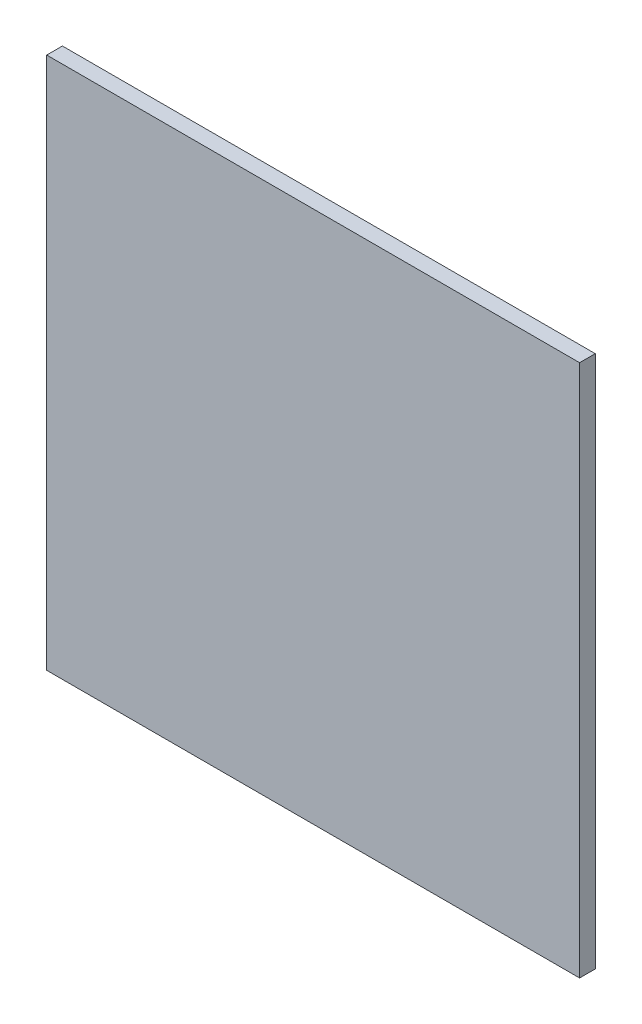
ISO-10303-21;
HEADER;
FILE_DESCRIPTION(('STEP AP214'),'2;1');
FILE_NAME('part.step','',(''),(''),'','','');
FILE_SCHEMA(('AUTOMOTIVE_DESIGN { 1 0 10303 214 1 1 1 1 }'));
ENDSEC;
DATA;
#1=APPLICATION_CONTEXT('core data for automotive mechanical design processes');
#2=APPLICATION_PROTOCOL_DEFINITION('international standard','automotive_design',2000,#1);
#3=PRODUCT_CONTEXT('',#1,'mechanical');
#4=PRODUCT('Part','Part','',(#3));
#5=PRODUCT_RELATED_PRODUCT_CATEGORY('part','',(#4));
#6=PRODUCT_DEFINITION_FORMATION('','',#4);
#7=PRODUCT_DEFINITION_CONTEXT('part definition',#1,'design');
#8=PRODUCT_DEFINITION('design','',#6,#7);
#9=PRODUCT_DEFINITION_SHAPE('','',#8);
#10=(LENGTH_UNIT() NAMED_UNIT(*) SI_UNIT(.MILLI.,.METRE.));
#11=(NAMED_UNIT(*) PLANE_ANGLE_UNIT() SI_UNIT($,.RADIAN.));
#12=(NAMED_UNIT(*) SI_UNIT($,.STERADIAN.) SOLID_ANGLE_UNIT());
#13=UNCERTAINTY_MEASURE_WITH_UNIT(LENGTH_MEASURE(1.E-05),#10,'distance_accuracy_value','');
#14=(GEOMETRIC_REPRESENTATION_CONTEXT(3) GLOBAL_UNCERTAINTY_ASSIGNED_CONTEXT((#13)) GLOBAL_UNIT_ASSIGNED_CONTEXT((#10,
#11,#12)) REPRESENTATION_CONTEXT('',''));
#15=CARTESIAN_POINT('',(0.,0.,0.));
#16=DIRECTION('',(0.,0.,1.));
#17=DIRECTION('',(1.,0.,0.));
#18=AXIS2_PLACEMENT_3D('',#15,#16,#17);
#19=CARTESIAN_POINT('',(51.,51.,3.));
#20=DIRECTION('',(-1.,0.,0.));
#21=DIRECTION('',(0.,-1.,0.));
#22=AXIS2_PLACEMENT_3D('',#19,#20,#21);
#23=PLANE('',#22);
#24=DIRECTION('',(0.,1.,0.));
#25=VECTOR('',#24,1.);
#26=CARTESIAN_POINT('',(51.,51.,0.));
#27=LINE('',#26,#25);
#28=CARTESIAN_POINT('',(51.,-51.,0.));
#29=VERTEX_POINT('',#28);
#30=CARTESIAN_POINT('',(51.,51.,0.));
#31=VERTEX_POINT('',#30);
#32=EDGE_CURVE('E99',#29,#31,#27,.T.);
#33=ORIENTED_EDGE('',*,*,#32,.T.);
#34=DIRECTION('',(0.,0.,-1.));
#35=VECTOR('',#34,1.);
#36=CARTESIAN_POINT('',(51.,51.,3.));
#37=LINE('',#36,#35);
#38=CARTESIAN_POINT('',(51.,51.,3.));
#39=VERTEX_POINT('',#38);
#40=EDGE_CURVE('E11',#39,#31,#37,.T.);
#41=ORIENTED_EDGE('',*,*,#40,.F.);
#42=DIRECTION('',(0.,1.,0.));
#43=VECTOR('',#42,1.);
#44=CARTESIAN_POINT('',(51.,51.,3.));
#45=LINE('',#44,#43);
#46=CARTESIAN_POINT('',(51.,-51.,3.));
#47=VERTEX_POINT('',#46);
#48=EDGE_CURVE('E87',#47,#39,#45,.T.);
#49=ORIENTED_EDGE('',*,*,#48,.F.);
#50=DIRECTION('',(0.,0.,-1.));
#51=VECTOR('',#50,1.);
#52=CARTESIAN_POINT('',(51.,-51.,3.));
#53=LINE('',#52,#51);
#54=EDGE_CURVE('E95',#47,#29,#53,.T.);
#55=ORIENTED_EDGE('',*,*,#54,.T.);
#56=EDGE_LOOP('',(#33,#41,#49,#55));
#57=FACE_BOUND('',#56,.T.);
#58=ADVANCED_FACE('F36',(#57),#23,.F.);
#59=CARTESIAN_POINT('',(-51.,51.,3.));
#60=DIRECTION('',(0.,-1.,0.));
#61=DIRECTION('',(0.,0.,-1.));
#62=AXIS2_PLACEMENT_3D('',#59,#60,#61);
#63=PLANE('',#62);
#64=DIRECTION('',(-1.,0.,0.));
#65=VECTOR('',#64,1.);
#66=CARTESIAN_POINT('',(-51.,51.,0.));
#67=LINE('',#66,#65);
#68=CARTESIAN_POINT('',(-51.,51.,0.));
#69=VERTEX_POINT('',#68);
#70=EDGE_CURVE('E91',#31,#69,#67,.T.);
#71=ORIENTED_EDGE('',*,*,#70,.T.);
#72=DIRECTION('',(0.,0.,-1.));
#73=VECTOR('',#72,1.);
#74=CARTESIAN_POINT('',(-51.,51.,3.));
#75=LINE('',#74,#73);
#76=CARTESIAN_POINT('',(-51.,51.,3.));
#77=VERTEX_POINT('',#76);
#78=EDGE_CURVE('E44',#77,#69,#75,.T.);
#79=ORIENTED_EDGE('',*,*,#78,.F.);
#80=DIRECTION('',(-1.,0.,0.));
#81=VECTOR('',#80,1.);
#82=CARTESIAN_POINT('',(-51.,51.,3.));
#83=LINE('',#82,#81);
#84=EDGE_CURVE('E82',#39,#77,#83,.T.);
#85=ORIENTED_EDGE('',*,*,#84,.F.);
#86=ORIENTED_EDGE('',*,*,#40,.T.);
#87=EDGE_LOOP('',(#71,#79,#85,#86));
#88=FACE_BOUND('',#87,.T.);
#89=ADVANCED_FACE('F90',(#88),#63,.F.);
#90=CARTESIAN_POINT('',(-51.,51.,3.));
#91=DIRECTION('',(1.,0.,0.));
#92=DIRECTION('',(0.,1.,0.));
#93=AXIS2_PLACEMENT_3D('',#90,#91,#92);
#94=PLANE('',#93);
#95=DIRECTION('',(0.,-1.,0.));
#96=VECTOR('',#95,1.);
#97=CARTESIAN_POINT('',(-51.,51.,0.));
#98=LINE('',#97,#96);
#99=CARTESIAN_POINT('',(-51.,-51.,0.));
#100=VERTEX_POINT('',#99);
#101=EDGE_CURVE('E69',#69,#100,#98,.T.);
#102=ORIENTED_EDGE('',*,*,#101,.T.);
#103=DIRECTION('',(0.,0.,-1.));
#104=VECTOR('',#103,1.);
#105=CARTESIAN_POINT('',(-51.,-51.,3.));
#106=LINE('',#105,#104);
#107=CARTESIAN_POINT('',(-51.,-51.,3.));
#108=VERTEX_POINT('',#107);
#109=EDGE_CURVE('E92',#108,#100,#106,.T.);
#110=ORIENTED_EDGE('',*,*,#109,.F.);
#111=DIRECTION('',(0.,-1.,0.));
#112=VECTOR('',#111,1.);
#113=CARTESIAN_POINT('',(-51.,51.,3.));
#114=LINE('',#113,#112);
#115=EDGE_CURVE('E85',#77,#108,#114,.T.);
#116=ORIENTED_EDGE('',*,*,#115,.F.);
#117=ORIENTED_EDGE('',*,*,#78,.T.);
#118=EDGE_LOOP('',(#102,#110,#116,#117));
#119=FACE_BOUND('',#118,.T.);
#120=ADVANCED_FACE('F93',(#119),#94,.F.);
#121=CARTESIAN_POINT('',(-51.,-51.,3.));
#122=DIRECTION('',(0.,1.,0.));
#123=DIRECTION('',(0.,0.,1.));
#124=AXIS2_PLACEMENT_3D('',#121,#122,#123);
#125=PLANE('',#124);
#126=DIRECTION('',(1.,0.,0.));
#127=VECTOR('',#126,1.);
#128=CARTESIAN_POINT('',(-51.,-51.,0.));
#129=LINE('',#128,#127);
#130=EDGE_CURVE('E75',#100,#29,#129,.T.);
#131=ORIENTED_EDGE('',*,*,#130,.T.);
#132=ORIENTED_EDGE('',*,*,#54,.F.);
#133=DIRECTION('',(1.,0.,0.));
#134=VECTOR('',#133,1.);
#135=CARTESIAN_POINT('',(-51.,-51.,3.));
#136=LINE('',#135,#134);
#137=EDGE_CURVE('E52',#108,#47,#136,.T.);
#138=ORIENTED_EDGE('',*,*,#137,.F.);
#139=ORIENTED_EDGE('',*,*,#109,.T.);
#140=EDGE_LOOP('',(#131,#132,#138,#139));
#141=FACE_BOUND('',#140,.T.);
#142=ADVANCED_FACE('F106',(#141),#125,.F.);
#143=CARTESIAN_POINT('',(0.,0.,3.));
#144=DIRECTION('',(0.,0.,1.));
#145=DIRECTION('',(1.,0.,0.));
#146=AXIS2_PLACEMENT_3D('',#143,#144,#145);
#147=PLANE('',#146);
#148=ORIENTED_EDGE('',*,*,#48,.T.);
#149=ORIENTED_EDGE('',*,*,#84,.T.);
#150=ORIENTED_EDGE('',*,*,#115,.T.);
#151=ORIENTED_EDGE('',*,*,#137,.T.);
#152=EDGE_LOOP('',(#148,#149,#150,#151));
#153=FACE_BOUND('',#152,.T.);
#154=ADVANCED_FACE('F83',(#153),#147,.T.);
#155=CARTESIAN_POINT('',(0.,0.,0.));
#156=DIRECTION('',(0.,0.,1.));
#157=DIRECTION('',(1.,0.,0.));
#158=AXIS2_PLACEMENT_3D('',#155,#156,#157);
#159=PLANE('',#158);
#160=ORIENTED_EDGE('',*,*,#32,.F.);
#161=ORIENTED_EDGE('',*,*,#130,.F.);
#162=ORIENTED_EDGE('',*,*,#101,.F.);
#163=ORIENTED_EDGE('',*,*,#70,.F.);
#164=EDGE_LOOP('',(#160,#161,#162,#163));
#165=FACE_BOUND('',#164,.T.);
#166=ADVANCED_FACE('F109',(#165),#159,.F.);
#167=CLOSED_SHELL('',(#58,#89,#120,#142,#154,#166));
#168=MANIFOLD_SOLID_BREP('B2',#167);
#169=ADVANCED_BREP_SHAPE_REPRESENTATION('',(#18,#168),#14);
#170=SHAPE_DEFINITION_REPRESENTATION(#9,#169);
ENDSEC;
END-ISO-10303-21;
